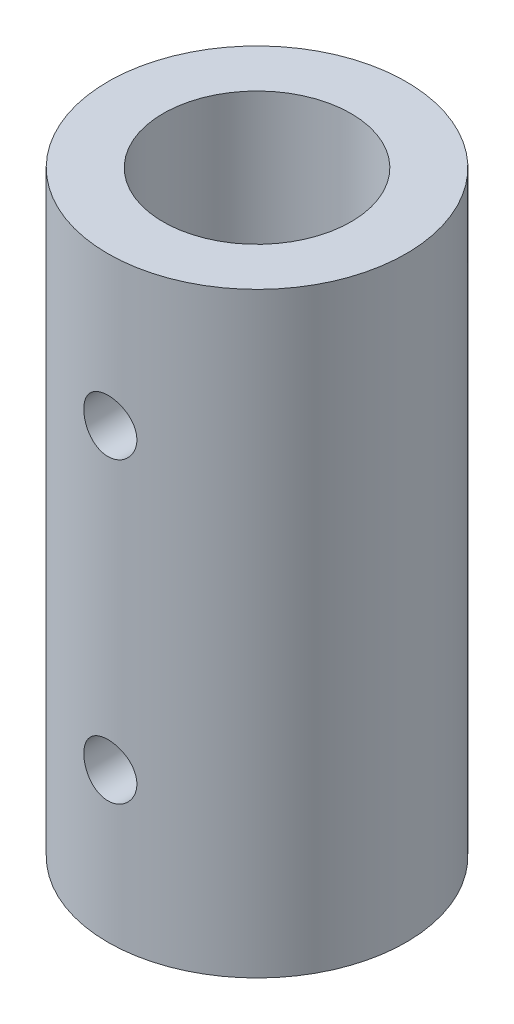
ISO-10303-21;
HEADER;
FILE_DESCRIPTION(('STEP AP214'),'2;1');
FILE_NAME('part.step','',(''),(''),'','','');
FILE_SCHEMA(('AUTOMOTIVE_DESIGN { 1 0 10303 214 1 1 1 1 }'));
ENDSEC;
DATA;
#1=APPLICATION_CONTEXT('core data for automotive mechanical design processes');
#2=APPLICATION_PROTOCOL_DEFINITION('international standard','automotive_design',2000,#1);
#3=PRODUCT_CONTEXT('',#1,'mechanical');
#4=PRODUCT('Part','Part','',(#3));
#5=PRODUCT_RELATED_PRODUCT_CATEGORY('part','',(#4));
#6=PRODUCT_DEFINITION_FORMATION('','',#4);
#7=PRODUCT_DEFINITION_CONTEXT('part definition',#1,'design');
#8=PRODUCT_DEFINITION('design','',#6,#7);
#9=PRODUCT_DEFINITION_SHAPE('','',#8);
#10=(LENGTH_UNIT() NAMED_UNIT(*) SI_UNIT(.MILLI.,.METRE.));
#11=(NAMED_UNIT(*) PLANE_ANGLE_UNIT() SI_UNIT($,.RADIAN.));
#12=(NAMED_UNIT(*) SI_UNIT($,.STERADIAN.) SOLID_ANGLE_UNIT());
#13=UNCERTAINTY_MEASURE_WITH_UNIT(LENGTH_MEASURE(1.E-05),#10,'distance_accuracy_value','');
#14=(GEOMETRIC_REPRESENTATION_CONTEXT(3) GLOBAL_UNCERTAINTY_ASSIGNED_CONTEXT((#13)) GLOBAL_UNIT_ASSIGNED_CONTEXT((#10,
#11,#12)) REPRESENTATION_CONTEXT('',''));
#15=CARTESIAN_POINT('',(0.,0.,0.));
#16=DIRECTION('',(0.,0.,1.));
#17=DIRECTION('',(1.,0.,0.));
#18=AXIS2_PLACEMENT_3D('',#15,#16,#17);
#19=CARTESIAN_POINT('',(0.,25.4,0.));
#20=DIRECTION('',(0.,-1.,0.));
#21=DIRECTION('',(0.,0.,-1.));
#22=AXIS2_PLACEMENT_3D('',#19,#20,#21);
#23=CYLINDRICAL_SURFACE('',#22,6.35);
#24=CARTESIAN_POINT('',(1.1303,6.35,6.2485935945619));
#25=CARTESIAN_POINT('',(1.13029752860319,6.4129474816605,6.24859477928636));
#26=CARTESIAN_POINT('',(1.12502376655344,6.47592772669888,6.24955510147455));
#27=CARTESIAN_POINT('',(1.10407989662448,6.60011645744907,6.253288450742));
#28=CARTESIAN_POINT('',(1.08840060868597,6.66132332883139,6.25606307842284));
#29=CARTESIAN_POINT('',(1.04713896619609,6.78015026397906,6.26310106017997));
#30=CARTESIAN_POINT('',(1.02156538976729,6.83777345470071,6.26736309431536));
#31=CARTESIAN_POINT('',(0.96126373679034,6.94790652333615,6.27689410394911));
#32=CARTESIAN_POINT('',(0.926536522350176,7.00041688214925,6.28216298460781));
#33=CARTESIAN_POINT('',(0.848497662550808,7.0994282501686,6.29318010060458));
#34=CARTESIAN_POINT('',(0.805103209146814,7.14586352406258,6.29893262327816));
#35=CARTESIAN_POINT('',(0.711140656114696,7.23083469001618,6.31023089151142));
#36=CARTESIAN_POINT('',(0.660572107820283,7.26937008765047,6.31577662411107));
#37=CARTESIAN_POINT('',(0.553267727306874,7.33769713569883,6.3260821366722));
#38=CARTESIAN_POINT('',(0.496492076393626,7.36742717538407,6.33083628120179));
#39=CARTESIAN_POINT('',(0.378653475620942,7.41690308225445,6.33897509325521));
#40=CARTESIAN_POINT('',(0.317590843835828,7.4366496892748,6.34235986225469));
#41=CARTESIAN_POINT('',(0.193591929496426,7.46539594690961,6.34734827608291));
#42=CARTESIAN_POINT('',(0.13068204924793,7.47450625308373,6.34897024782024));
#43=CARTESIAN_POINT('',(0.00420718696587988,7.4820657608453,6.35031338922828));
#44=CARTESIAN_POINT('',(-0.0593577441923804,7.48051578423727,6.35003470542113));
#45=CARTESIAN_POINT('',(-0.18458054378409,7.4668842622789,6.34762234490442));
#46=CARTESIAN_POINT('',(-0.246251841595397,7.45492183576535,6.34550965008509));
#47=CARTESIAN_POINT('',(-0.366697607884811,7.42099299078743,6.33969011077832));
#48=CARTESIAN_POINT('',(-0.425471978630507,7.39902623506687,6.33598321254887));
#49=CARTESIAN_POINT('',(-0.538805120450371,7.345596503427,6.32735638635074));
#50=CARTESIAN_POINT('',(-0.593340631871784,7.31408522290982,6.32243031191731));
#51=CARTESIAN_POINT('',(-0.696394590932213,7.24249642495821,6.31191110570192));
#52=CARTESIAN_POINT('',(-0.744912484459764,7.20241811958306,6.30631791258354));
#53=CARTESIAN_POINT('',(-0.835258832297389,7.11417450408076,6.29499388871477));
#54=CARTESIAN_POINT('',(-0.87698549929935,7.06590502301524,6.28926222422367));
#55=CARTESIAN_POINT('',(-0.951765111250201,6.96299812033824,6.27838159660169));
#56=CARTESIAN_POINT('',(-0.984817952788778,6.90836062281775,6.27323264041835));
#57=CARTESIAN_POINT('',(-1.04133641697596,6.79414166467476,6.26409955120621));
#58=CARTESIAN_POINT('',(-1.06478844399584,6.73455333578239,6.26011707226906));
#59=CARTESIAN_POINT('',(-1.10132048259893,6.61219582604084,6.25379407198502));
#60=CARTESIAN_POINT('',(-1.11440154509545,6.54942696816783,6.25145338427448));
#61=CARTESIAN_POINT('',(-1.12967421074342,6.42340468476552,6.24871157429963));
#62=CARTESIAN_POINT('',(-1.13201151497741,6.36016946405966,6.24828450262102));
#63=CARTESIAN_POINT('',(-1.12611980656729,6.23421190744061,6.24934899119854));
#64=CARTESIAN_POINT('',(-1.11789126229031,6.17148954891709,6.25084046640858));
#65=CARTESIAN_POINT('',(-1.09122611970099,6.04880954780009,6.25554991782972));
#66=CARTESIAN_POINT('',(-1.07286485766721,5.98883499749475,6.25875514695102));
#67=CARTESIAN_POINT('',(-1.02653498701514,5.87281385159103,6.26652011136834));
#68=CARTESIAN_POINT('',(-0.998565732092793,5.81676752053894,6.27107993778172));
#69=CARTESIAN_POINT('',(-0.933474479097983,5.70954878726828,6.28109997867828));
#70=CARTESIAN_POINT('',(-0.896259814835748,5.65843349045935,6.28656911125703));
#71=CARTESIAN_POINT('',(-0.81386013074054,5.56312065938619,6.29776598333192));
#72=CARTESIAN_POINT('',(-0.768674468015055,5.51892368365494,6.30349374365968));
#73=CARTESIAN_POINT('',(-0.670967135208996,5.43816353360303,6.3146452745759));
#74=CARTESIAN_POINT('',(-0.618364201269166,5.40169796577111,6.3200645909399));
#75=CARTESIAN_POINT('',(-0.50769408739231,5.33812217243745,6.32991535892806));
#76=CARTESIAN_POINT('',(-0.449627102767371,5.31101161270319,6.33434684584306));
#77=CARTESIAN_POINT('',(-0.329956377996445,5.26706424712549,6.34170339516869));
#78=CARTESIAN_POINT('',(-0.26837124516651,5.25017803607877,6.34463569095833));
#79=CARTESIAN_POINT('',(-0.143182328625896,5.22700033003814,6.34869419748068));
#80=CARTESIAN_POINT('',(-0.0795787360337629,5.22070783500607,6.34982057868977));
#81=CARTESIAN_POINT('',(0.0469027850895835,5.2189281674832,6.35013741439244));
#82=CARTESIAN_POINT('',(0.109778614269503,5.22329307113839,6.3493543717336));
#83=CARTESIAN_POINT('',(0.233886077679077,5.24238221219445,6.34599495704242));
#84=CARTESIAN_POINT('',(0.295117724437981,5.25710637063087,6.34341859867981));
#85=CARTESIAN_POINT('',(0.414130647219048,5.29643628901857,6.3367614767518));
#86=CARTESIAN_POINT('',(0.471916767035405,5.3210277821713,6.33268288590209));
#87=CARTESIAN_POINT('',(0.582565157591165,5.3793772011528,6.32346454814741));
#88=CARTESIAN_POINT('',(0.635427142672249,5.41313565833019,6.31832473973479));
#89=CARTESIAN_POINT('',(0.735467702991133,5.48937711212491,6.30746821917931));
#90=CARTESIAN_POINT('',(0.782563586469946,5.5319676821887,6.3017448838471));
#91=CARTESIAN_POINT('',(0.868991600851845,5.6244398122169,6.29041003362776));
#92=CARTESIAN_POINT('',(0.908321908493054,5.6743230796437,6.2847985452783));
#93=CARTESIAN_POINT('',(0.97840270597492,5.78045289515873,6.27427269331679));
#94=CARTESIAN_POINT('',(1.00908013748217,5.83674830361509,6.26936442851344));
#95=CARTESIAN_POINT('',(1.06049430719683,5.95376063547625,6.26087346378714));
#96=CARTESIAN_POINT('',(1.08124068756143,6.01447320395225,6.25728947888211));
#97=CARTESIAN_POINT('',(1.10785061597257,6.12116068175458,6.2526226773509));
#98=CARTESIAN_POINT('',(1.116255146414,6.16650046594738,6.25112047177959));
#99=CARTESIAN_POINT('',(1.1274806794138,6.25788766220765,6.24910550811149));
#100=CARTESIAN_POINT('',(1.13030180856719,6.30393505820726,6.24859272758101));
#101=CARTESIAN_POINT('',(1.1303,6.35,6.2485935945619));
#102=B_SPLINE_CURVE_WITH_KNOTS('',3,(#24,#25,#26,#27,#28,#29,#30,#31,#32,#33,#34,#35,#36,#37,
#38,#39,#40,#41,#42,#43,#44,#45,#46,#47,#48,#49,#50,#51,#52,#53,#54,#55,#56,#57,#58,#59,#60,#61,
#62,#63,#64,#65,#66,#67,#68,#69,#70,#71,#72,#73,#74,#75,#76,#77,#78,#79,#80,#81,#82,#83,#84,#85,
#86,#87,#88,#89,#90,#91,#92,#93,#94,#95,#96,#97,#98,#99,#100,#101),.UNSPECIFIED.,.T.,.F.,(4,2,2,
2,2,2,2,2,2,2,2,2,2,2,2,2,2,2,2,2,2,2,2,2,2,2,2,2,2,2,2,2,2,2,2,2,2,2,4),(0.,0.188673929647674,
0.377514534626138,0.566187984707763,0.754843671490909,0.945396353842155,1.13596095857324,
1.32782903745418,1.5196828956175,1.70952248173694,1.89934743322769,2.08702890425,
2.27471670267543,2.46337072228334,2.65204210056539,2.84332262546284,3.03460543072443,
3.22615818062715,3.41769151757454,3.60661956640561,3.79553924064848,3.98307286921064,
4.17061911513114,4.3601268464934,4.5496498693968,4.74143924348985,4.93322176468823,
5.12407001760692,5.31490025359553,5.50309687534893,5.69129206257061,5.87921612052191,
6.06715107352078,6.25752581883365,6.44794520878686,6.63992726090083,6.83172253573716,
6.96979717232731,7.10786867825192),.UNSPECIFIED.);
#103=CARTESIAN_POINT('',(1.1303,6.35,6.2485935945619));
#104=VERTEX_POINT('',#103);
#105=EDGE_CURVE('E50',#104,#104,#102,.T.);
#106=ORIENTED_EDGE('',*,*,#105,.F.);
#107=EDGE_LOOP('',(#106));
#108=FACE_BOUND('',#107,.T.);
#109=CARTESIAN_POINT('',(1.1303,19.05,6.2485935945619));
#110=CARTESIAN_POINT('',(1.13029752860319,19.1129474816605,6.24859477928636));
#111=CARTESIAN_POINT('',(1.12502376655344,19.1759277266989,6.24955510147455));
#112=CARTESIAN_POINT('',(1.10407989662448,19.3001164574491,6.253288450742));
#113=CARTESIAN_POINT('',(1.08840060868598,19.3613233288314,6.25606307842284));
#114=CARTESIAN_POINT('',(1.04713896619609,19.4801502639791,6.26310106017997));
#115=CARTESIAN_POINT('',(1.02156538976729,19.5377734547007,6.26736309431536));
#116=CARTESIAN_POINT('',(0.961263736790341,19.6479065233362,6.27689410394911));
#117=CARTESIAN_POINT('',(0.926536522350177,19.7004168821493,6.2821629846078));
#118=CARTESIAN_POINT('',(0.848497662550809,19.7994282501686,6.29318010060458));
#119=CARTESIAN_POINT('',(0.805103209146815,19.8458635240626,6.29893262327816));
#120=CARTESIAN_POINT('',(0.711140656114698,19.9308346900162,6.31023089151142));
#121=CARTESIAN_POINT('',(0.660572107820285,19.9693700876505,6.31577662411107));
#122=CARTESIAN_POINT('',(0.553267727306876,20.0376971356988,6.3260821366722));
#123=CARTESIAN_POINT('',(0.496492076393627,20.0674271753841,6.33083628120179));
#124=CARTESIAN_POINT('',(0.378653475620944,20.1169030822544,6.33897509325521));
#125=CARTESIAN_POINT('',(0.317590843835831,20.1366496892748,6.34235986225469));
#126=CARTESIAN_POINT('',(0.193591929496429,20.1653959469096,6.34734827608291));
#127=CARTESIAN_POINT('',(0.130682049247933,20.1745062530837,6.34897024782024));
#128=CARTESIAN_POINT('',(0.00420718696588254,20.1820657608453,6.35031338922828));
#129=CARTESIAN_POINT('',(-0.0593577441923779,20.1805157842373,6.35003470542113));
#130=CARTESIAN_POINT('',(-0.184580543784088,20.1668842622789,6.34762234490442));
#131=CARTESIAN_POINT('',(-0.246251841595395,20.1549218357653,6.34550965008509));
#132=CARTESIAN_POINT('',(-0.36669760788481,20.1209929907874,6.33969011077832));
#133=CARTESIAN_POINT('',(-0.425471978630506,20.0990262350669,6.33598321254887));
#134=CARTESIAN_POINT('',(-0.53880512045037,20.045596503427,6.32735638635074));
#135=CARTESIAN_POINT('',(-0.593340631871783,20.0140852229098,6.32243031191731));
#136=CARTESIAN_POINT('',(-0.696394590932212,19.9424964249582,6.31191110570192));
#137=CARTESIAN_POINT('',(-0.744912484459763,19.9024181195831,6.30631791258354));
#138=CARTESIAN_POINT('',(-0.835258832297389,19.8141745040808,6.29499388871477));
#139=CARTESIAN_POINT('',(-0.87698549929935,19.7659050230152,6.28926222422367));
#140=CARTESIAN_POINT('',(-0.951765111250202,19.6629981203382,6.27838159660169));
#141=CARTESIAN_POINT('',(-0.984817952788779,19.6083606228178,6.27323264041835));
#142=CARTESIAN_POINT('',(-1.04133641697596,19.4941416646748,6.26409955120621));
#143=CARTESIAN_POINT('',(-1.06478844399584,19.4345533357824,6.26011707226906));
#144=CARTESIAN_POINT('',(-1.10132048259893,19.3121958260408,6.25379407198502));
#145=CARTESIAN_POINT('',(-1.11440154509545,19.2494269681678,6.25145338427448));
#146=CARTESIAN_POINT('',(-1.12967421074342,19.1234046847655,6.24871157429962));
#147=CARTESIAN_POINT('',(-1.13201151497741,19.0601694640597,6.24828450262101));
#148=CARTESIAN_POINT('',(-1.1261198065673,18.9342119074406,6.24934899119854));
#149=CARTESIAN_POINT('',(-1.11789126229031,18.8714895489171,6.25084046640858));
#150=CARTESIAN_POINT('',(-1.09122611970099,18.7488095478001,6.25554991782972));
#151=CARTESIAN_POINT('',(-1.07286485766721,18.6888349974948,6.25875514695102));
#152=CARTESIAN_POINT('',(-1.02653498701515,18.572813851591,6.26652011136834));
#153=CARTESIAN_POINT('',(-0.998565732092795,18.5167675205389,6.27107993778172));
#154=CARTESIAN_POINT('',(-0.933474479097985,18.4095487872683,6.28109997867828));
#155=CARTESIAN_POINT('',(-0.896259814835751,18.3584334904594,6.28656911125702));
#156=CARTESIAN_POINT('',(-0.813860130740543,18.2631206593862,6.29776598333192));
#157=CARTESIAN_POINT('',(-0.768674468015057,18.2189236836549,6.30349374365968));
#158=CARTESIAN_POINT('',(-0.670967135208999,18.138163533603,6.3146452745759));
#159=CARTESIAN_POINT('',(-0.618364201269168,18.1016979657711,6.32006459093989));
#160=CARTESIAN_POINT('',(-0.507694087392312,18.0381221724374,6.32991535892806));
#161=CARTESIAN_POINT('',(-0.449627102767373,18.0110116127032,6.33434684584306));
#162=CARTESIAN_POINT('',(-0.329956377996447,17.9670642471255,6.34170339516869));
#163=CARTESIAN_POINT('',(-0.268371245166512,17.9501780360788,6.34463569095833));
#164=CARTESIAN_POINT('',(-0.143182328625899,17.9270003300381,6.34869419748068));
#165=CARTESIAN_POINT('',(-0.0795787360337656,17.9207078350061,6.34982057868977));
#166=CARTESIAN_POINT('',(0.0469027850895804,17.9189281674832,6.35013741439244));
#167=CARTESIAN_POINT('',(0.1097786142695,17.9232930711384,6.3493543717336));
#168=CARTESIAN_POINT('',(0.233886077679074,17.9423822121944,6.34599495704242));
#169=CARTESIAN_POINT('',(0.295117724437978,17.9571063706309,6.34341859867981));
#170=CARTESIAN_POINT('',(0.414130647219046,17.9964362890186,6.3367614767518));
#171=CARTESIAN_POINT('',(0.471916767035404,18.0210277821713,6.33268288590209));
#172=CARTESIAN_POINT('',(0.582565157591164,18.0793772011528,6.32346454814741));
#173=CARTESIAN_POINT('',(0.635427142672247,18.1131356583302,6.31832473973479));
#174=CARTESIAN_POINT('',(0.735467702991131,18.1893771121249,6.30746821917931));
#175=CARTESIAN_POINT('',(0.782563586469944,18.2319676821887,6.3017448838471));
#176=CARTESIAN_POINT('',(0.868991600851843,18.3244398122169,6.29041003362776));
#177=CARTESIAN_POINT('',(0.908321908493052,18.3743230796437,6.2847985452783));
#178=CARTESIAN_POINT('',(0.978402705974919,18.4804528951587,6.27427269331679));
#179=CARTESIAN_POINT('',(1.00908013748217,18.5367483036151,6.26936442851344));
#180=CARTESIAN_POINT('',(1.06049430719683,18.6537606354762,6.26087346378714));
#181=CARTESIAN_POINT('',(1.08124068756143,18.7144732039522,6.25728947888211));
#182=CARTESIAN_POINT('',(1.10785061597257,18.8211606817546,6.2526226773509));
#183=CARTESIAN_POINT('',(1.116255146414,18.8665004659474,6.25112047177959));
#184=CARTESIAN_POINT('',(1.1274806794138,18.9578876622076,6.24910550811149));
#185=CARTESIAN_POINT('',(1.13030180856719,19.0039350582073,6.24859272758101));
#186=CARTESIAN_POINT('',(1.1303,19.05,6.2485935945619));
#187=B_SPLINE_CURVE_WITH_KNOTS('',3,(#109,#110,#111,#112,#113,#114,#115,#116,#117,#118,#119,
#120,#121,#122,#123,#124,#125,#126,#127,#128,#129,#130,#131,#132,#133,#134,#135,#136,#137,#138,
#139,#140,#141,#142,#143,#144,#145,#146,#147,#148,#149,#150,#151,#152,#153,#154,#155,#156,#157,
#158,#159,#160,#161,#162,#163,#164,#165,#166,#167,#168,#169,#170,#171,#172,#173,#174,#175,#176,
#177,#178,#179,#180,#181,#182,#183,#184,#185,#186),.UNSPECIFIED.,.T.,.F.,(4,2,2,2,2,2,2,2,2,2,2,
2,2,2,2,2,2,2,2,2,2,2,2,2,2,2,2,2,2,2,2,2,2,2,2,2,2,2,4),(0.,0.188673929647675,
0.377514534626136,0.566187984707764,0.754843671490909,0.945396353842153,1.13596095857323,
1.32782903745418,1.51968289561749,1.70952248173694,1.89934743322768,2.08702890424999,
2.27471670267543,2.46337072228334,2.6520421005654,2.84332262546284,3.03460543072443,
3.22615818062715,3.41769151757455,3.60661956640561,3.79553924064848,3.98307286921064,
4.17061911513114,4.3601268464934,4.5496498693968,4.74143924348985,4.93322176468823,
5.12407001760691,5.31490025359553,5.50309687534892,5.69129206257061,5.87921612052191,
6.06715107352078,6.25752581883365,6.44794520878686,6.63992726090084,6.83172253573716,
6.96979717232731,7.10786867825193),.UNSPECIFIED.);
#188=CARTESIAN_POINT('',(1.1303,19.05,6.2485935945619));
#189=VERTEX_POINT('',#188);
#190=EDGE_CURVE('E53',#189,#189,#187,.T.);
#191=ORIENTED_EDGE('',*,*,#190,.F.);
#192=EDGE_LOOP('',(#191));
#193=FACE_BOUND('',#192,.T.);
#194=CARTESIAN_POINT('',(0.,25.4,0.));
#195=DIRECTION('',(0.,1.,0.));
#196=DIRECTION('',(0.,0.,1.));
#197=AXIS2_PLACEMENT_3D('',#194,#195,#196);
#198=CIRCLE('',#197,6.35);
#199=CARTESIAN_POINT('',(0.,25.4,6.35));
#200=VERTEX_POINT('',#199);
#201=EDGE_CURVE('E10',#200,#200,#198,.T.);
#202=ORIENTED_EDGE('',*,*,#201,.F.);
#203=EDGE_LOOP('',(#202));
#204=FACE_BOUND('',#203,.T.);
#205=CARTESIAN_POINT('',(0.,0.,0.));
#206=DIRECTION('',(0.,1.,0.));
#207=DIRECTION('',(0.,0.,1.));
#208=AXIS2_PLACEMENT_3D('',#205,#206,#207);
#209=CIRCLE('',#208,6.35);
#210=CARTESIAN_POINT('',(0.,0.,6.35));
#211=VERTEX_POINT('',#210);
#212=EDGE_CURVE('E38',#211,#211,#209,.T.);
#213=ORIENTED_EDGE('',*,*,#212,.T.);
#214=EDGE_LOOP('',(#213));
#215=FACE_BOUND('',#214,.T.);
#216=ADVANCED_FACE('F35',(#108,#193,#204,#215),#23,.T.);
#217=CARTESIAN_POINT('',(0.,25.4,0.));
#218=DIRECTION('',(0.,1.,0.));
#219=DIRECTION('',(0.,0.,1.));
#220=AXIS2_PLACEMENT_3D('',#217,#218,#219);
#221=PLANE('',#220);
#222=CARTESIAN_POINT('',(0.,25.4,0.));
#223=DIRECTION('',(0.,-1.,0.));
#224=DIRECTION('',(0.,0.,-1.));
#225=AXIS2_PLACEMENT_3D('',#222,#223,#224);
#226=CIRCLE('',#225,4.0005);
#227=CARTESIAN_POINT('',(0.,25.4,-4.0005));
#228=VERTEX_POINT('',#227);
#229=EDGE_CURVE('E45',#228,#228,#226,.T.);
#230=ORIENTED_EDGE('',*,*,#229,.T.);
#231=EDGE_LOOP('',(#230));
#232=FACE_BOUND('',#231,.T.);
#233=ORIENTED_EDGE('',*,*,#201,.T.);
#234=EDGE_LOOP('',(#233));
#235=FACE_BOUND('',#234,.T.);
#236=ADVANCED_FACE('F77',(#232,#235),#221,.T.);
#237=CARTESIAN_POINT('',(0.,0.,0.));
#238=DIRECTION('',(0.,1.,0.));
#239=DIRECTION('',(0.,0.,1.));
#240=AXIS2_PLACEMENT_3D('',#237,#238,#239);
#241=PLANE('',#240);
#242=CARTESIAN_POINT('',(0.,0.,0.));
#243=DIRECTION('',(0.,-1.,0.));
#244=DIRECTION('',(0.,0.,-1.));
#245=AXIS2_PLACEMENT_3D('',#242,#243,#244);
#246=CIRCLE('',#245,4.0005);
#247=CARTESIAN_POINT('',(0.,0.,-4.0005));
#248=VERTEX_POINT('',#247);
#249=EDGE_CURVE('E47',#248,#248,#246,.T.);
#250=ORIENTED_EDGE('',*,*,#249,.F.);
#251=EDGE_LOOP('',(#250));
#252=FACE_BOUND('',#251,.T.);
#253=ORIENTED_EDGE('',*,*,#212,.F.);
#254=EDGE_LOOP('',(#253));
#255=FACE_BOUND('',#254,.T.);
#256=ADVANCED_FACE('F75',(#252,#255),#241,.F.);
#257=CARTESIAN_POINT('',(0.,25.4,0.));
#258=DIRECTION('',(0.,-1.,0.));
#259=DIRECTION('',(0.,0.,-1.));
#260=AXIS2_PLACEMENT_3D('',#257,#258,#259);
#261=CYLINDRICAL_SURFACE('',#260,4.0005);
#262=CARTESIAN_POINT('',(1.1303,6.35,3.83750207296361));
#263=CARTESIAN_POINT('',(1.13029881146711,6.28788592367413,3.83750298391038));
#264=CARTESIAN_POINT('',(1.12516247499522,6.22575975030498,3.83902664421412));
#265=CARTESIAN_POINT('',(1.10479817143099,6.10331184959197,3.84493564827521));
#266=CARTESIAN_POINT('',(1.08956593803019,6.04299089636287,3.84932220181755));
#267=CARTESIAN_POINT('',(1.04955880119953,5.92594295267332,3.8604213971392));
#268=CARTESIAN_POINT('',(1.02479844005085,5.86921063796178,3.8671304925856));
#269=CARTESIAN_POINT('',(0.966484564083541,5.76069387198247,3.88211418010889));
#270=CARTESIAN_POINT('',(0.932930065709389,5.70890997504114,3.89038894726512));
#271=CARTESIAN_POINT('',(0.85697259681822,5.61030646526066,3.90783201780921));
#272=CARTESIAN_POINT('',(0.814366554860046,5.56364632040406,3.91701767636674));
#273=CARTESIAN_POINT('',(0.721951459487022,5.47802942935901,3.93509846888052));
#274=CARTESIAN_POINT('',(0.672141580889583,5.43907356688992,3.94399356941074));
#275=CARTESIAN_POINT('',(0.565613685423207,5.3692934028605,3.96068628948753));
#276=CARTESIAN_POINT('',(0.508786696481947,5.33862951805808,3.9684610601047));
#277=CARTESIAN_POINT('',(0.390526654493352,5.28735315859018,3.98183682738919));
#278=CARTESIAN_POINT('',(0.329094480082407,5.26673877215537,3.987438237465));
#279=CARTESIAN_POINT('',(0.205034263863408,5.23666805276627,3.99571340394489));
#280=CARTESIAN_POINT('',(0.14247691147827,5.22694001424211,3.99845832474132));
#281=CARTESIAN_POINT('',(0.0165618749246996,5.2180613105885,4.00096088327303));
#282=CARTESIAN_POINT('',(-0.046795657302295,5.21890866665168,4.00071907986716));
#283=CARTESIAN_POINT('',(-0.170614498677899,5.23096949697169,3.9973267295327));
#284=CARTESIAN_POINT('',(-0.231107040631202,5.24188911449701,3.99425864233504));
#285=CARTESIAN_POINT('',(-0.349363267106376,5.27330732867235,3.98565709797974));
#286=CARTESIAN_POINT('',(-0.407126786988941,5.29380650243742,3.98012349228924));
#287=CARTESIAN_POINT('',(-0.519011431724134,5.34401484195211,3.96709422404738));
#288=CARTESIAN_POINT('',(-0.573086622331159,5.37382083141306,3.95957806993112));
#289=CARTESIAN_POINT('',(-0.675565182606441,5.44172141348004,3.9433878082856));
#290=CARTESIAN_POINT('',(-0.723967328847994,5.47981778891674,3.93471345184259));
#291=CARTESIAN_POINT('',(-0.815480217263496,5.5647614154732,3.9167899024772));
#292=CARTESIAN_POINT('',(-0.858352131962661,5.61186427776539,3.90753119888498));
#293=CARTESIAN_POINT('',(-0.935650931305264,5.71268475291129,3.8897474295998));
#294=CARTESIAN_POINT('',(-0.970077161782747,5.76640287767075,3.88122242076884));
#295=CARTESIAN_POINT('',(-1.02971956978015,5.87949769220113,3.86582954464471));
#296=CARTESIAN_POINT('',(-1.05486321729813,5.93891455527662,3.85897486410862));
#297=CARTESIAN_POINT('',(-1.09472245738957,6.06137565580201,3.84785862560608));
#298=CARTESIAN_POINT('',(-1.10944100618285,6.12441885945239,3.84359633257111));
#299=CARTESIAN_POINT('',(-1.12760462003759,6.25009101484849,3.83830629141133));
#300=CARTESIAN_POINT('',(-1.13140909822249,6.31266373277509,3.83717546551162));
#301=CARTESIAN_POINT('',(-1.12863308134295,6.43755286628085,3.83799296068869));
#302=CARTESIAN_POINT('',(-1.12205384842732,6.49986931208701,3.83994090753809));
#303=CARTESIAN_POINT('',(-1.09901559356887,6.62104010831915,3.84659613935838));
#304=CARTESIAN_POINT('',(-1.08277966173505,6.67994064035147,3.85124106255429));
#305=CARTESIAN_POINT('',(-1.04114331842067,6.79418049665287,3.86270424307277));
#306=CARTESIAN_POINT('',(-1.01574160534212,6.84951931382041,3.86952280905011));
#307=CARTESIAN_POINT('',(-0.955787485565369,6.95654921170394,3.88477112527686));
#308=CARTESIAN_POINT('',(-0.921027883247859,7.00811910888478,3.89323597404496));
#309=CARTESIAN_POINT('',(-0.843596459725414,7.10482579054631,3.91074390338757));
#310=CARTESIAN_POINT('',(-0.800922962559379,7.1499612087807,3.91978710617645));
#311=CARTESIAN_POINT('',(-0.707199886252196,7.23404648499151,3.93779321935515));
#312=CARTESIAN_POINT('',(-0.655920774084994,7.2727437360404,3.94674368145071));
#313=CARTESIAN_POINT('',(-0.547389016030666,7.34098506113115,3.9632529399234));
#314=CARTESIAN_POINT('',(-0.49013668464065,7.37052961674854,3.97081180951166));
#315=CARTESIAN_POINT('',(-0.371682223757537,7.41934616721417,3.98363785328489));
#316=CARTESIAN_POINT('',(-0.310514097350031,7.43869590538953,3.98892231316729));
#317=CARTESIAN_POINT('',(-0.185620640105777,7.46678877682168,3.99668043962595));
#318=CARTESIAN_POINT('',(-0.121895955493672,7.47553457321652,3.9991548119347));
#319=CARTESIAN_POINT('',(0.00395403144937127,7.48198770161711,4.00097614785141));
#320=CARTESIAN_POINT('',(0.0660591797110014,7.48006351954925,4.00042751468783));
#321=CARTESIAN_POINT('',(0.189025329725492,7.46609859683467,3.99650520312081));
#322=CARTESIAN_POINT('',(0.249886388644993,7.45405832210363,3.99313165482416));
#323=CARTESIAN_POINT('',(0.36813631070084,7.42042105473945,3.98396362726557));
#324=CARTESIAN_POINT('',(0.425550462683753,7.39890685576794,3.97819014525728));
#325=CARTESIAN_POINT('',(0.535986132882072,7.34700607880452,3.96482240522868));
#326=CARTESIAN_POINT('',(0.589006979510236,7.31661814752056,3.95722786951948));
#327=CARTESIAN_POINT('',(0.690832985807685,7.24679946201561,3.94074737868197));
#328=CARTESIAN_POINT('',(0.739469632822508,7.2071303617397,3.93183016553073));
#329=CARTESIAN_POINT('',(0.829519913523745,7.12031676923241,3.91382294978893));
#330=CARTESIAN_POINT('',(0.870931562554414,7.07317022976978,3.90473290047956));
#331=CARTESIAN_POINT('',(0.946410145165625,6.97129397594916,3.88713922682954));
#332=CARTESIAN_POINT('',(0.980262671433599,6.91640144411727,3.87865648813337));
#333=CARTESIAN_POINT('',(1.03821377883186,6.8014714285368,3.86354951714337));
#334=CARTESIAN_POINT('',(1.06231798067148,6.74143693382032,3.85692421456316));
#335=CARTESIAN_POINT('',(1.09738110688922,6.62646330431878,3.84708178481228));
#336=CARTESIAN_POINT('',(1.10969446827572,6.57196329869585,3.84352064059059));
#337=CARTESIAN_POINT('',(1.12615383817329,6.46164532055316,3.83873054969922));
#338=CARTESIAN_POINT('',(1.13030106824216,6.40582754642054,3.83750125421323));
#339=CARTESIAN_POINT('',(1.1303,6.35,3.83750207296361));
#340=B_SPLINE_CURVE_WITH_KNOTS('',3,(#262,#263,#264,#265,#266,#267,#268,#269,#270,#271,#272,
#273,#274,#275,#276,#277,#278,#279,#280,#281,#282,#283,#284,#285,#286,#287,#288,#289,#290,#291,
#292,#293,#294,#295,#296,#297,#298,#299,#300,#301,#302,#303,#304,#305,#306,#307,#308,#309,#310,
#311,#312,#313,#314,#315,#316,#317,#318,#319,#320,#321,#322,#323,#324,#325,#326,#327,#328,#329,
#330,#331,#332,#333,#334,#335,#336,#337,#338,#339),.UNSPECIFIED.,.T.,.F.,(4,2,2,2,2,2,2,2,2,2,2,
2,2,2,2,2,2,2,2,2,2,2,2,2,2,2,2,2,2,2,2,2,2,2,2,2,2,2,4),(0.,0.186136649711366,0.3723520069517,
0.558284273539473,0.744237344078945,0.934912796678942,1.12561010802913,1.31976849546699,
1.51388993269865,1.70305013737494,1.89217494800603,2.07595085082222,2.25973782654325,
2.44550439458103,2.63131095088863,2.82349903435625,3.01570199918013,3.20937646922866,
3.40299599746907,3.59016183724683,3.77730492861181,3.96028394505988,4.14328895590014,
4.33073713320995,4.51822505268851,4.71188638149438,4.9055375189413,5.097689724567,
5.28979366192306,5.47530556436878,5.66080892318328,5.84472236065289,6.0286638605749,
6.21798165596766,6.40735137401758,6.60155380713302,6.79564410641358,6.96296700442023,
7.13026487097478),.UNSPECIFIED.);
#341=CARTESIAN_POINT('',(1.1303,6.35,3.83750207296361));
#342=VERTEX_POINT('',#341);
#343=EDGE_CURVE('E61',#342,#342,#340,.T.);
#344=ORIENTED_EDGE('',*,*,#343,.F.);
#345=EDGE_LOOP('',(#344));
#346=FACE_BOUND('',#345,.T.);
#347=CARTESIAN_POINT('',(1.1303,19.05,3.83750207296361));
#348=CARTESIAN_POINT('',(1.13029881146711,18.9878859236741,3.83750298391038));
#349=CARTESIAN_POINT('',(1.12516247499522,18.925759750305,3.83902664421412));
#350=CARTESIAN_POINT('',(1.10479817143099,18.803311849592,3.84493564827521));
#351=CARTESIAN_POINT('',(1.08956593803019,18.7429908963629,3.84932220181755));
#352=CARTESIAN_POINT('',(1.04955880119953,18.6259429526733,3.8604213971392));
#353=CARTESIAN_POINT('',(1.02479844005085,18.5692106379618,3.8671304925856));
#354=CARTESIAN_POINT('',(0.966484564083543,18.4606938719825,3.88211418010889));
#355=CARTESIAN_POINT('',(0.932930065709392,18.4089099750411,3.89038894726512));
#356=CARTESIAN_POINT('',(0.856972596818224,18.3103064652607,3.90783201780921));
#357=CARTESIAN_POINT('',(0.81436655486005,18.2636463204041,3.91701767636674));
#358=CARTESIAN_POINT('',(0.721951459487025,18.178029429359,3.93509846888052));
#359=CARTESIAN_POINT('',(0.672141580889585,18.1390735668899,3.94399356941074));
#360=CARTESIAN_POINT('',(0.565613685423209,18.0692934028605,3.96068628948753));
#361=CARTESIAN_POINT('',(0.508786696481949,18.0386295180581,3.9684610601047));
#362=CARTESIAN_POINT('',(0.390526654493353,17.9873531585902,3.98183682738919));
#363=CARTESIAN_POINT('',(0.329094480082408,17.9667387721554,3.987438237465));
#364=CARTESIAN_POINT('',(0.205034263863409,17.9366680527663,3.99571340394489));
#365=CARTESIAN_POINT('',(0.142476911478271,17.9269400142421,3.99845832474132));
#366=CARTESIAN_POINT('',(0.0165618749247002,17.9180613105885,4.00096088327303));
#367=CARTESIAN_POINT('',(-0.0467956573022943,17.9189086666517,4.00071907986716));
#368=CARTESIAN_POINT('',(-0.170614498677899,17.9309694969717,3.9973267295327));
#369=CARTESIAN_POINT('',(-0.231107040631202,17.941889114497,3.99425864233504));
#370=CARTESIAN_POINT('',(-0.349363267106377,17.9733073286723,3.98565709797974));
#371=CARTESIAN_POINT('',(-0.407126786988941,17.9938065024374,3.98012349228924));
#372=CARTESIAN_POINT('',(-0.519011431724134,18.0440148419521,3.96709422404738));
#373=CARTESIAN_POINT('',(-0.57308662233116,18.0738208314131,3.95957806993112));
#374=CARTESIAN_POINT('',(-0.675565182606442,18.14172141348,3.9433878082856));
#375=CARTESIAN_POINT('',(-0.723967328847994,18.1798177889167,3.93471345184259));
#376=CARTESIAN_POINT('',(-0.815480217263496,18.2647614154732,3.9167899024772));
#377=CARTESIAN_POINT('',(-0.85835213196266,18.3118642777654,3.90753119888498));
#378=CARTESIAN_POINT('',(-0.935650931305264,18.4126847529113,3.8897474295998));
#379=CARTESIAN_POINT('',(-0.970077161782748,18.4664028776707,3.88122242076883));
#380=CARTESIAN_POINT('',(-1.02971956978015,18.5794976922011,3.86582954464471));
#381=CARTESIAN_POINT('',(-1.05486321729813,18.6389145552766,3.85897486410862));
#382=CARTESIAN_POINT('',(-1.09472245738957,18.761375655802,3.84785862560608));
#383=CARTESIAN_POINT('',(-1.10944100618285,18.8244188594524,3.84359633257111));
#384=CARTESIAN_POINT('',(-1.12760462003759,18.9500910148485,3.83830629141133));
#385=CARTESIAN_POINT('',(-1.13140909822249,19.0126637327751,3.83717546551162));
#386=CARTESIAN_POINT('',(-1.12863308134295,19.1375528662808,3.83799296068869));
#387=CARTESIAN_POINT('',(-1.12205384842732,19.199869312087,3.83994090753809));
#388=CARTESIAN_POINT('',(-1.09901559356887,19.3210401083191,3.84659613935838));
#389=CARTESIAN_POINT('',(-1.08277966173505,19.3799406403515,3.85124106255429));
#390=CARTESIAN_POINT('',(-1.04114331842067,19.4941804966529,3.86270424307277));
#391=CARTESIAN_POINT('',(-1.01574160534212,19.5495193138204,3.86952280905011));
#392=CARTESIAN_POINT('',(-0.955787485565369,19.6565492117039,3.88477112527686));
#393=CARTESIAN_POINT('',(-0.921027883247859,19.7081191088848,3.89323597404496));
#394=CARTESIAN_POINT('',(-0.843596459725415,19.8048257905463,3.91074390338757));
#395=CARTESIAN_POINT('',(-0.800922962559381,19.8499612087807,3.91978710617645));
#396=CARTESIAN_POINT('',(-0.707199886252198,19.9340464849915,3.93779321935514));
#397=CARTESIAN_POINT('',(-0.655920774084995,19.9727437360404,3.9467436814507));
#398=CARTESIAN_POINT('',(-0.547389016030666,20.0409850611311,3.9632529399234));
#399=CARTESIAN_POINT('',(-0.490136684640649,20.0705296167485,3.97081180951166));
#400=CARTESIAN_POINT('',(-0.371682223757537,20.1193461672142,3.98363785328489));
#401=CARTESIAN_POINT('',(-0.310514097350031,20.1386959053895,3.98892231316729));
#402=CARTESIAN_POINT('',(-0.185620640105778,20.1667887768217,3.99668043962595));
#403=CARTESIAN_POINT('',(-0.121895955493673,20.1755345732165,3.9991548119347));
#404=CARTESIAN_POINT('',(0.00395403144937057,20.1819877016171,4.00097614785141));
#405=CARTESIAN_POINT('',(0.0660591797110009,20.1800635195492,4.00042751468783));
#406=CARTESIAN_POINT('',(0.189025329725491,20.1660985968347,3.99650520312081));
#407=CARTESIAN_POINT('',(0.249886388644992,20.1540583221036,3.99313165482416));
#408=CARTESIAN_POINT('',(0.368136310700839,20.1204210547395,3.98396362726557));
#409=CARTESIAN_POINT('',(0.425550462683753,20.0989068557679,3.97819014525728));
#410=CARTESIAN_POINT('',(0.535986132882073,20.0470060788045,3.96482240522868));
#411=CARTESIAN_POINT('',(0.589006979510236,20.0166181475206,3.95722786951948));
#412=CARTESIAN_POINT('',(0.690832985807684,19.9467994620156,3.94074737868197));
#413=CARTESIAN_POINT('',(0.739469632822508,19.9071303617397,3.93183016553073));
#414=CARTESIAN_POINT('',(0.829519913523745,19.8203167692324,3.91382294978893));
#415=CARTESIAN_POINT('',(0.870931562554413,19.7731702297698,3.90473290047956));
#416=CARTESIAN_POINT('',(0.946410145165624,19.6712939759492,3.88713922682954));
#417=CARTESIAN_POINT('',(0.980262671433597,19.6164014441173,3.87865648813337));
#418=CARTESIAN_POINT('',(1.03821377883186,19.5014714285368,3.86354951714337));
#419=CARTESIAN_POINT('',(1.06231798067148,19.4414369338203,3.85692421456316));
#420=CARTESIAN_POINT('',(1.09738110688922,19.3264633043188,3.84708178481228));
#421=CARTESIAN_POINT('',(1.10969446827572,19.2719632986958,3.84352064059059));
#422=CARTESIAN_POINT('',(1.12615383817329,19.1616453205532,3.83873054969922));
#423=CARTESIAN_POINT('',(1.13030106824216,19.1058275464205,3.83750125421323));
#424=CARTESIAN_POINT('',(1.1303,19.05,3.83750207296361));
#425=B_SPLINE_CURVE_WITH_KNOTS('',3,(#347,#348,#349,#350,#351,#352,#353,#354,#355,#356,#357,
#358,#359,#360,#361,#362,#363,#364,#365,#366,#367,#368,#369,#370,#371,#372,#373,#374,#375,#376,
#377,#378,#379,#380,#381,#382,#383,#384,#385,#386,#387,#388,#389,#390,#391,#392,#393,#394,#395,
#396,#397,#398,#399,#400,#401,#402,#403,#404,#405,#406,#407,#408,#409,#410,#411,#412,#413,#414,
#415,#416,#417,#418,#419,#420,#421,#422,#423,#424),.UNSPECIFIED.,.T.,.F.,(4,2,2,2,2,2,2,2,2,2,2,
2,2,2,2,2,2,2,2,2,2,2,2,2,2,2,2,2,2,2,2,2,2,2,2,2,2,2,4),(0.,0.186136649711362,
0.372352006951699,0.558284273539472,0.744237344078941,0.934912796678938,1.12561010802913,
1.31976849546699,1.51388993269865,1.70305013737494,1.89217494800603,2.07595085082222,
2.25973782654325,2.44550439458103,2.63131095088863,2.82349903435625,3.01570199918013,
3.20937646922867,3.40299599746907,3.59016183724683,3.77730492861181,3.96028394505988,
4.14328895590014,4.33073713320995,4.51822505268851,4.71188638149438,4.9055375189413,
5.097689724567,5.28979366192306,5.47530556436878,5.66080892318328,5.84472236065289,
6.0286638605749,6.21798165596767,6.40735137401758,6.60155380713302,6.79564410641358,
6.96296700442024,7.13026487097478),.UNSPECIFIED.);
#426=CARTESIAN_POINT('',(1.1303,19.05,3.83750207296361));
#427=VERTEX_POINT('',#426);
#428=EDGE_CURVE('E62',#427,#427,#425,.T.);
#429=ORIENTED_EDGE('',*,*,#428,.F.);
#430=EDGE_LOOP('',(#429));
#431=FACE_BOUND('',#430,.T.);
#432=ORIENTED_EDGE('',*,*,#229,.F.);
#433=EDGE_LOOP('',(#432));
#434=FACE_BOUND('',#433,.T.);
#435=ORIENTED_EDGE('',*,*,#249,.T.);
#436=EDGE_LOOP('',(#435));
#437=FACE_BOUND('',#436,.T.);
#438=ADVANCED_FACE('F72',(#346,#431,#434,#437),#261,.F.);
#439=CARTESIAN_POINT('',(0.,19.05,-6.351));
#440=DIRECTION('',(0.,0.,1.));
#441=DIRECTION('',(1.,0.,0.));
#442=AXIS2_PLACEMENT_3D('',#439,#440,#441);
#443=CYLINDRICAL_SURFACE('',#442,1.1303);
#444=ORIENTED_EDGE('',*,*,#428,.T.);
#445=EDGE_LOOP('',(#444));
#446=FACE_BOUND('',#445,.T.);
#447=ORIENTED_EDGE('',*,*,#190,.T.);
#448=EDGE_LOOP('',(#447));
#449=FACE_BOUND('',#448,.T.);
#450=ADVANCED_FACE('F68',(#446,#449),#443,.F.);
#451=CARTESIAN_POINT('',(0.,6.35,-6.351));
#452=DIRECTION('',(0.,0.,1.));
#453=DIRECTION('',(1.,0.,0.));
#454=AXIS2_PLACEMENT_3D('',#451,#452,#453);
#455=CYLINDRICAL_SURFACE('',#454,1.1303);
#456=ORIENTED_EDGE('',*,*,#343,.T.);
#457=EDGE_LOOP('',(#456));
#458=FACE_BOUND('',#457,.T.);
#459=ORIENTED_EDGE('',*,*,#105,.T.);
#460=EDGE_LOOP('',(#459));
#461=FACE_BOUND('',#460,.T.);
#462=ADVANCED_FACE('F99',(#458,#461),#455,.F.);
#463=CLOSED_SHELL('',(#216,#236,#256,#438,#450,#462));
#464=MANIFOLD_SOLID_BREP('B2',#463);
#465=ADVANCED_BREP_SHAPE_REPRESENTATION('',(#18,#464),#14);
#466=SHAPE_DEFINITION_REPRESENTATION(#9,#465);
ENDSEC;
END-ISO-10303-21;
